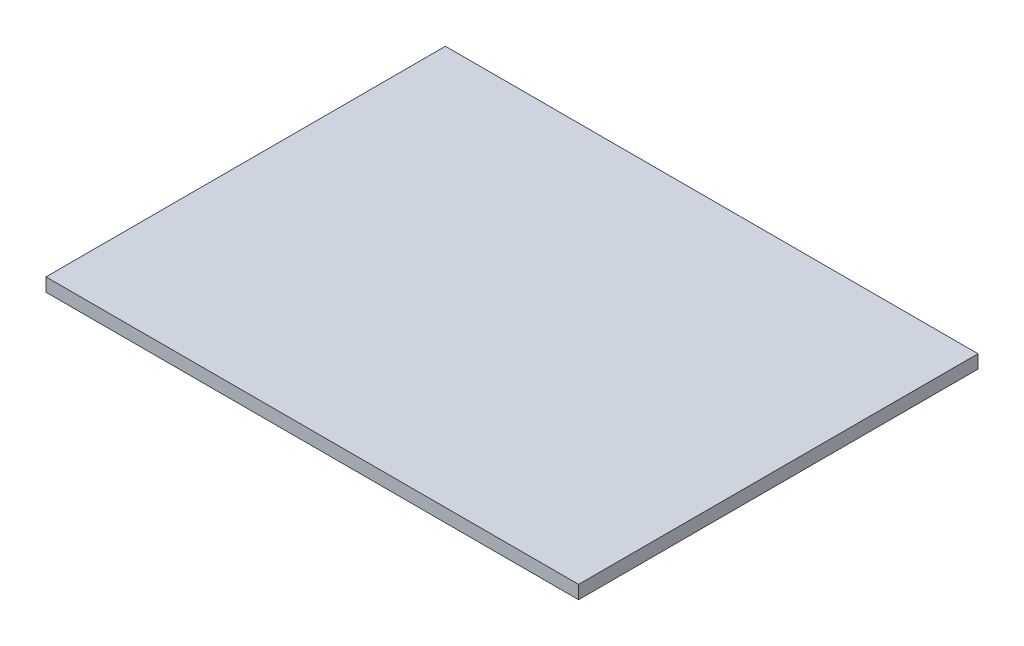
ISO-10303-21;
HEADER;
FILE_DESCRIPTION(('STEP AP214'),'2;1');
FILE_NAME('part.step','',(''),(''),'','','');
FILE_SCHEMA(('AUTOMOTIVE_DESIGN { 1 0 10303 214 1 1 1 1 }'));
ENDSEC;
DATA;
#1=APPLICATION_CONTEXT('core data for automotive mechanical design processes');
#2=APPLICATION_PROTOCOL_DEFINITION('international standard','automotive_design',2000,#1);
#3=PRODUCT_CONTEXT('',#1,'mechanical');
#4=PRODUCT('Part','Part','',(#3));
#5=PRODUCT_RELATED_PRODUCT_CATEGORY('part','',(#4));
#6=PRODUCT_DEFINITION_FORMATION('','',#4);
#7=PRODUCT_DEFINITION_CONTEXT('part definition',#1,'design');
#8=PRODUCT_DEFINITION('design','',#6,#7);
#9=PRODUCT_DEFINITION_SHAPE('','',#8);
#10=(LENGTH_UNIT() NAMED_UNIT(*) SI_UNIT(.MILLI.,.METRE.));
#11=(NAMED_UNIT(*) PLANE_ANGLE_UNIT() SI_UNIT($,.RADIAN.));
#12=(NAMED_UNIT(*) SI_UNIT($,.STERADIAN.) SOLID_ANGLE_UNIT());
#13=UNCERTAINTY_MEASURE_WITH_UNIT(LENGTH_MEASURE(1.E-05),#10,'distance_accuracy_value','');
#14=(GEOMETRIC_REPRESENTATION_CONTEXT(3) GLOBAL_UNCERTAINTY_ASSIGNED_CONTEXT((#13)) GLOBAL_UNIT_ASSIGNED_CONTEXT((#10,
#11,#12)) REPRESENTATION_CONTEXT('',''));
#15=CARTESIAN_POINT('',(0.,0.,0.));
#16=DIRECTION('',(0.,0.,1.));
#17=DIRECTION('',(1.,0.,0.));
#18=AXIS2_PLACEMENT_3D('',#15,#16,#17);
#19=CARTESIAN_POINT('',(-15.,-10.,-25.9807621135332));
#20=DIRECTION('',(-0.866025403784439,0.,-0.5));
#21=DIRECTION('',(-0.5,0.,0.866025403784439));
#22=AXIS2_PLACEMENT_3D('',#19,#20,#21);
#23=PLANE('',#22);
#24=CARTESIAN_POINT('',(-19.0000000000002,-5.,-19.0525588832575));
#25=DIRECTION('',(-0.866025403784443,0.,-0.499999999999992));
#26=DIRECTION('',(-0.499999999999992,0.,0.866025403784443));
#27=AXIS2_PLACEMENT_3D('',#24,#25,#26);
#28=CIRCLE('',#27,1.24999999999999);
#29=CARTESIAN_POINT('',(-19.6250000000002,-5.,-17.9700271285269));
#30=VERTEX_POINT('',#29);
#31=EDGE_CURVE('E247',#30,#30,#28,.T.);
#32=ORIENTED_EDGE('',*,*,#31,.F.);
#33=EDGE_LOOP('',(#32));
#34=FACE_BOUND('',#33,.T.);
#35=CARTESIAN_POINT('',(-26.0000000000001,-5.,-6.92820323027527));
#36=DIRECTION('',(-0.866025403784443,0.,-0.499999999999992));
#37=DIRECTION('',(-0.499999999999992,0.,0.866025403784443));
#38=AXIS2_PLACEMENT_3D('',#35,#36,#37);
#39=CIRCLE('',#38,1.24999999999999);
#40=CARTESIAN_POINT('',(-26.6250000000001,-5.,-5.84567147554473));
#41=VERTEX_POINT('',#40);
#42=EDGE_CURVE('E249',#41,#41,#39,.T.);
#43=ORIENTED_EDGE('',*,*,#42,.F.);
#44=EDGE_LOOP('',(#43));
#45=FACE_BOUND('',#44,.T.);
#46=DIRECTION('',(-0.5,0.,0.866025403784439));
#47=VECTOR('',#46,1.);
#48=CARTESIAN_POINT('',(-15.,0.,-25.9807621135332));
#49=LINE('',#48,#47);
#50=CARTESIAN_POINT('',(-15.,0.,-25.9807621135332));
#51=VERTEX_POINT('',#50);
#52=CARTESIAN_POINT('',(-30.,0.,0.));
#53=VERTEX_POINT('',#52);
#54=EDGE_CURVE('E143',#51,#53,#49,.T.);
#55=ORIENTED_EDGE('',*,*,#54,.F.);
#56=DIRECTION('',(0.,1.,0.));
#57=VECTOR('',#56,1.);
#58=CARTESIAN_POINT('',(-15.,-10.,-25.9807621135332));
#59=LINE('',#58,#57);
#60=CARTESIAN_POINT('',(-15.,-10.,-25.9807621135332));
#61=VERTEX_POINT('',#60);
#62=EDGE_CURVE('E12',#61,#51,#59,.T.);
#63=ORIENTED_EDGE('',*,*,#62,.F.);
#64=DIRECTION('',(-0.5,0.,0.866025403784439));
#65=VECTOR('',#64,1.);
#66=CARTESIAN_POINT('',(-15.,-10.,-25.9807621135332));
#67=LINE('',#66,#65);
#68=CARTESIAN_POINT('',(-30.,-10.,0.));
#69=VERTEX_POINT('',#68);
#70=EDGE_CURVE('E158',#61,#69,#67,.T.);
#71=ORIENTED_EDGE('',*,*,#70,.T.);
#72=DIRECTION('',(0.,1.,0.));
#73=VECTOR('',#72,1.);
#74=CARTESIAN_POINT('',(-30.,-10.,0.));
#75=LINE('',#74,#73);
#76=EDGE_CURVE('E58',#69,#53,#75,.T.);
#77=ORIENTED_EDGE('',*,*,#76,.T.);
#78=EDGE_LOOP('',(#55,#63,#71,#77));
#79=FACE_BOUND('',#78,.T.);
#80=ADVANCED_FACE('F55',(#34,#45,#79),#23,.T.);
#81=CARTESIAN_POINT('',(15.,-10.,-25.9807621135332));
#82=DIRECTION('',(0.,0.,-1.));
#83=DIRECTION('',(-1.,0.,0.));
#84=AXIS2_PLACEMENT_3D('',#81,#82,#83);
#85=PLANE('',#84);
#86=DIRECTION('',(-1.,0.,0.));
#87=VECTOR('',#86,1.);
#88=CARTESIAN_POINT('',(15.,0.,-25.9807621135332));
#89=LINE('',#88,#87);
#90=CARTESIAN_POINT('',(15.,0.,-25.9807621135332));
#91=VERTEX_POINT('',#90);
#92=EDGE_CURVE('E156',#91,#51,#89,.T.);
#93=ORIENTED_EDGE('',*,*,#92,.F.);
#94=DIRECTION('',(0.,1.,0.));
#95=VECTOR('',#94,1.);
#96=CARTESIAN_POINT('',(15.,-10.,-25.9807621135332));
#97=LINE('',#96,#95);
#98=CARTESIAN_POINT('',(15.,-10.,-25.9807621135332));
#99=VERTEX_POINT('',#98);
#100=EDGE_CURVE('E64',#99,#91,#97,.T.);
#101=ORIENTED_EDGE('',*,*,#100,.F.);
#102=DIRECTION('',(-1.,0.,0.));
#103=VECTOR('',#102,1.);
#104=CARTESIAN_POINT('',(15.,-10.,-25.9807621135332));
#105=LINE('',#104,#103);
#106=EDGE_CURVE('E133',#99,#61,#105,.T.);
#107=ORIENTED_EDGE('',*,*,#106,.T.);
#108=ORIENTED_EDGE('',*,*,#62,.T.);
#109=EDGE_LOOP('',(#93,#101,#107,#108));
#110=FACE_BOUND('',#109,.T.);
#111=ADVANCED_FACE('F166',(#110),#85,.T.);
#112=CARTESIAN_POINT('',(30.,-10.,0.));
#113=DIRECTION('',(0.866025403784439,0.,-0.5));
#114=DIRECTION('',(-0.5,0.,-0.866025403784439));
#115=AXIS2_PLACEMENT_3D('',#112,#113,#114);
#116=PLANE('',#115);
#117=CARTESIAN_POINT('',(26.,-5.,-6.92820323027564));
#118=DIRECTION('',(0.866025403784436,0.,-0.500000000000004));
#119=DIRECTION('',(-0.500000000000004,0.,-0.866025403784436));
#120=AXIS2_PLACEMENT_3D('',#117,#118,#119);
#121=CIRCLE('',#120,1.24999999999999);
#122=CARTESIAN_POINT('',(25.375,-5.,-8.01073498500617));
#123=VERTEX_POINT('',#122);
#124=EDGE_CURVE('E257',#123,#123,#121,.T.);
#125=ORIENTED_EDGE('',*,*,#124,.F.);
#126=EDGE_LOOP('',(#125));
#127=FACE_BOUND('',#126,.T.);
#128=CARTESIAN_POINT('',(18.9999999999999,-5.,-19.0525588832577));
#129=DIRECTION('',(0.866025403784436,0.,-0.500000000000004));
#130=DIRECTION('',(-0.500000000000004,0.,-0.866025403784436));
#131=AXIS2_PLACEMENT_3D('',#128,#129,#130);
#132=CIRCLE('',#131,1.24999999999999);
#133=CARTESIAN_POINT('',(18.3749999999999,-5.,-20.1350906379883));
#134=VERTEX_POINT('',#133);
#135=EDGE_CURVE('E263',#134,#134,#132,.T.);
#136=ORIENTED_EDGE('',*,*,#135,.F.);
#137=EDGE_LOOP('',(#136));
#138=FACE_BOUND('',#137,.T.);
#139=DIRECTION('',(-0.5,0.,-0.866025403784439));
#140=VECTOR('',#139,1.);
#141=CARTESIAN_POINT('',(30.,0.,0.));
#142=LINE('',#141,#140);
#143=CARTESIAN_POINT('',(30.,0.,0.));
#144=VERTEX_POINT('',#143);
#145=EDGE_CURVE('E120',#144,#91,#142,.T.);
#146=ORIENTED_EDGE('',*,*,#145,.F.);
#147=DIRECTION('',(0.,1.,0.));
#148=VECTOR('',#147,1.);
#149=CARTESIAN_POINT('',(30.,-10.,0.));
#150=LINE('',#149,#148);
#151=CARTESIAN_POINT('',(30.,-10.,0.));
#152=VERTEX_POINT('',#151);
#153=EDGE_CURVE('E115',#152,#144,#150,.T.);
#154=ORIENTED_EDGE('',*,*,#153,.F.);
#155=DIRECTION('',(-0.5,0.,-0.866025403784439));
#156=VECTOR('',#155,1.);
#157=CARTESIAN_POINT('',(30.,-10.,0.));
#158=LINE('',#157,#156);
#159=EDGE_CURVE('E118',#152,#99,#158,.T.);
#160=ORIENTED_EDGE('',*,*,#159,.T.);
#161=ORIENTED_EDGE('',*,*,#100,.T.);
#162=EDGE_LOOP('',(#146,#154,#160,#161));
#163=FACE_BOUND('',#162,.T.);
#164=ADVANCED_FACE('F117',(#127,#138,#163),#116,.T.);
#165=CARTESIAN_POINT('',(15.,-10.,25.9807621135332));
#166=DIRECTION('',(0.866025403784439,0.,0.5));
#167=DIRECTION('',(0.5,0.,-0.866025403784439));
#168=AXIS2_PLACEMENT_3D('',#165,#166,#167);
#169=PLANE('',#168);
#170=DIRECTION('',(0.5,0.,-0.866025403784439));
#171=VECTOR('',#170,1.);
#172=CARTESIAN_POINT('',(15.,0.,25.9807621135332));
#173=LINE('',#172,#171);
#174=CARTESIAN_POINT('',(15.,0.,25.9807621135332));
#175=VERTEX_POINT('',#174);
#176=EDGE_CURVE('E153',#175,#144,#173,.T.);
#177=ORIENTED_EDGE('',*,*,#176,.F.);
#178=DIRECTION('',(0.,1.,0.));
#179=VECTOR('',#178,1.);
#180=CARTESIAN_POINT('',(15.,-10.,25.9807621135332));
#181=LINE('',#180,#179);
#182=CARTESIAN_POINT('',(15.,-10.,25.9807621135332));
#183=VERTEX_POINT('',#182);
#184=EDGE_CURVE('E125',#183,#175,#181,.T.);
#185=ORIENTED_EDGE('',*,*,#184,.F.);
#186=DIRECTION('',(0.5,0.,-0.866025403784439));
#187=VECTOR('',#186,1.);
#188=CARTESIAN_POINT('',(15.,-10.,25.9807621135332));
#189=LINE('',#188,#187);
#190=EDGE_CURVE('E131',#183,#152,#189,.T.);
#191=ORIENTED_EDGE('',*,*,#190,.T.);
#192=ORIENTED_EDGE('',*,*,#153,.T.);
#193=EDGE_LOOP('',(#177,#185,#191,#192));
#194=FACE_BOUND('',#193,.T.);
#195=ADVANCED_FACE('F135',(#194),#169,.T.);
#196=CARTESIAN_POINT('',(-15.,-10.,25.9807621135332));
#197=DIRECTION('',(0.,0.,1.));
#198=DIRECTION('',(1.,0.,0.));
#199=AXIS2_PLACEMENT_3D('',#196,#197,#198);
#200=PLANE('',#199);
#201=CARTESIAN_POINT('',(-7.,-5.,25.9807621135332));
#202=DIRECTION('',(0.,0.,1.));
#203=DIRECTION('',(1.,0.,0.));
#204=AXIS2_PLACEMENT_3D('',#201,#202,#203);
#205=CIRCLE('',#204,1.24999999999999);
#206=CARTESIAN_POINT('',(-5.75000000000001,-5.,25.9807621135332));
#207=VERTEX_POINT('',#206);
#208=EDGE_CURVE('E269',#207,#207,#205,.T.);
#209=ORIENTED_EDGE('',*,*,#208,.F.);
#210=EDGE_LOOP('',(#209));
#211=FACE_BOUND('',#210,.T.);
#212=CARTESIAN_POINT('',(7.,-5.,25.9807621135332));
#213=DIRECTION('',(0.,0.,1.));
#214=DIRECTION('',(1.,0.,0.));
#215=AXIS2_PLACEMENT_3D('',#212,#213,#214);
#216=CIRCLE('',#215,1.24999999999999);
#217=CARTESIAN_POINT('',(8.24999999999999,-5.,25.9807621135332));
#218=VERTEX_POINT('',#217);
#219=EDGE_CURVE('E275',#218,#218,#216,.T.);
#220=ORIENTED_EDGE('',*,*,#219,.F.);
#221=EDGE_LOOP('',(#220));
#222=FACE_BOUND('',#221,.T.);
#223=DIRECTION('',(1.,0.,0.));
#224=VECTOR('',#223,1.);
#225=CARTESIAN_POINT('',(-15.,0.,25.9807621135332));
#226=LINE('',#225,#224);
#227=CARTESIAN_POINT('',(-15.,0.,25.9807621135332));
#228=VERTEX_POINT('',#227);
#229=EDGE_CURVE('E150',#228,#175,#226,.T.);
#230=ORIENTED_EDGE('',*,*,#229,.F.);
#231=DIRECTION('',(0.,1.,0.));
#232=VECTOR('',#231,1.);
#233=CARTESIAN_POINT('',(-15.,-10.,25.9807621135332));
#234=LINE('',#233,#232);
#235=CARTESIAN_POINT('',(-15.,-10.,25.9807621135332));
#236=VERTEX_POINT('',#235);
#237=EDGE_CURVE('E161',#236,#228,#234,.T.);
#238=ORIENTED_EDGE('',*,*,#237,.F.);
#239=DIRECTION('',(1.,0.,0.));
#240=VECTOR('',#239,1.);
#241=CARTESIAN_POINT('',(-15.,-10.,25.9807621135332));
#242=LINE('',#241,#240);
#243=EDGE_CURVE('E136',#236,#183,#242,.T.);
#244=ORIENTED_EDGE('',*,*,#243,.T.);
#245=ORIENTED_EDGE('',*,*,#184,.T.);
#246=EDGE_LOOP('',(#230,#238,#244,#245));
#247=FACE_BOUND('',#246,.T.);
#248=ADVANCED_FACE('F181',(#211,#222,#247),#200,.T.);
#249=CARTESIAN_POINT('',(-30.,-10.,0.));
#250=DIRECTION('',(-0.866025403784438,0.,0.5));
#251=DIRECTION('',(0.5,0.,0.866025403784439));
#252=AXIS2_PLACEMENT_3D('',#249,#250,#251);
#253=PLANE('',#252);
#254=DIRECTION('',(0.5,0.,0.866025403784439));
#255=VECTOR('',#254,1.);
#256=CARTESIAN_POINT('',(-30.,0.,0.));
#257=LINE('',#256,#255);
#258=EDGE_CURVE('E146',#53,#228,#257,.T.);
#259=ORIENTED_EDGE('',*,*,#258,.F.);
#260=ORIENTED_EDGE('',*,*,#76,.F.);
#261=DIRECTION('',(0.5,0.,0.866025403784439));
#262=VECTOR('',#261,1.);
#263=CARTESIAN_POINT('',(-30.,-10.,0.));
#264=LINE('',#263,#262);
#265=EDGE_CURVE('E138',#69,#236,#264,.T.);
#266=ORIENTED_EDGE('',*,*,#265,.T.);
#267=ORIENTED_EDGE('',*,*,#237,.T.);
#268=EDGE_LOOP('',(#259,#260,#266,#267));
#269=FACE_BOUND('',#268,.T.);
#270=ADVANCED_FACE('F163',(#269),#253,.T.);
#271=CARTESIAN_POINT('',(0.,-10.,0.));
#272=DIRECTION('',(0.,1.,0.));
#273=DIRECTION('',(0.,0.,1.));
#274=AXIS2_PLACEMENT_3D('',#271,#272,#273);
#275=PLANE('',#274);
#276=ORIENTED_EDGE('',*,*,#70,.F.);
#277=ORIENTED_EDGE('',*,*,#106,.F.);
#278=ORIENTED_EDGE('',*,*,#159,.F.);
#279=ORIENTED_EDGE('',*,*,#190,.F.);
#280=ORIENTED_EDGE('',*,*,#243,.F.);
#281=ORIENTED_EDGE('',*,*,#265,.F.);
#282=EDGE_LOOP('',(#276,#277,#278,#279,#280,#281));
#283=FACE_BOUND('',#282,.T.);
#284=ADVANCED_FACE('F129',(#283),#275,.F.);
#285=CARTESIAN_POINT('',(0.,0.,0.));
#286=DIRECTION('',(0.,1.,0.));
#287=DIRECTION('',(0.,0.,1.));
#288=AXIS2_PLACEMENT_3D('',#285,#286,#287);
#289=PLANE('',#288);
#290=ORIENTED_EDGE('',*,*,#54,.T.);
#291=ORIENTED_EDGE('',*,*,#258,.T.);
#292=ORIENTED_EDGE('',*,*,#229,.T.);
#293=ORIENTED_EDGE('',*,*,#176,.T.);
#294=ORIENTED_EDGE('',*,*,#145,.T.);
#295=ORIENTED_EDGE('',*,*,#92,.T.);
#296=EDGE_LOOP('',(#290,#291,#292,#293,#294,#295));
#297=FACE_BOUND('',#296,.T.);
#298=ADVANCED_FACE('F165',(#297),#289,.T.);
#299=CARTESIAN_POINT('',(7.,-5.,15.9807621135332));
#300=DIRECTION('',(0.,0.,1.));
#301=DIRECTION('',(1.,0.,0.));
#302=AXIS2_PLACEMENT_3D('',#299,#300,#301);
#303=CONICAL_SURFACE('',#302,1.25,1.02974425867665);
#304=CARTESIAN_POINT('',(7.,-5.,15.2296863397487));
#305=VERTEX_POINT('',#304);
#306=VERTEX_LOOP('',#305);
#307=FACE_BOUND('',#306,.T.);
#308=CARTESIAN_POINT('',(7.,-5.,15.9807621135332));
#309=DIRECTION('',(0.,0.,1.));
#310=DIRECTION('',(1.,0.,0.));
#311=AXIS2_PLACEMENT_3D('',#308,#309,#310);
#312=CIRCLE('',#311,1.25);
#313=CARTESIAN_POINT('',(8.25,-5.,15.9807621135332));
#314=VERTEX_POINT('',#313);
#315=EDGE_CURVE('E147',#314,#314,#312,.T.);
#316=ORIENTED_EDGE('',*,*,#315,.T.);
#317=EDGE_LOOP('',(#316));
#318=FACE_BOUND('',#317,.T.);
#319=ADVANCED_FACE('F191',(#307,#318),#303,.F.);
#320=CARTESIAN_POINT('',(7.,-5.,25.9807621135332));
#321=DIRECTION('',(0.,0.,1.));
#322=DIRECTION('',(1.,0.,0.));
#323=AXIS2_PLACEMENT_3D('',#320,#321,#322);
#324=CYLINDRICAL_SURFACE('',#323,1.24999999999999);
#325=ORIENTED_EDGE('',*,*,#315,.F.);
#326=EDGE_LOOP('',(#325));
#327=FACE_BOUND('',#326,.T.);
#328=ORIENTED_EDGE('',*,*,#219,.T.);
#329=EDGE_LOOP('',(#328));
#330=FACE_BOUND('',#329,.T.);
#331=ADVANCED_FACE('F195',(#327,#330),#324,.F.);
#332=CARTESIAN_POINT('',(-7.,-5.,15.9807621135332));
#333=DIRECTION('',(0.,0.,1.));
#334=DIRECTION('',(1.,0.,0.));
#335=AXIS2_PLACEMENT_3D('',#332,#333,#334);
#336=CONICAL_SURFACE('',#335,1.25,1.02974425867665);
#337=CARTESIAN_POINT('',(-7.,-5.,15.2296863397487));
#338=VERTEX_POINT('',#337);
#339=VERTEX_LOOP('',#338);
#340=FACE_BOUND('',#339,.T.);
#341=CARTESIAN_POINT('',(-7.,-5.,15.9807621135332));
#342=DIRECTION('',(0.,0.,1.));
#343=DIRECTION('',(1.,0.,0.));
#344=AXIS2_PLACEMENT_3D('',#341,#342,#343);
#345=CIRCLE('',#344,1.25);
#346=CARTESIAN_POINT('',(-5.75,-5.,15.9807621135332));
#347=VERTEX_POINT('',#346);
#348=EDGE_CURVE('E272',#347,#347,#345,.T.);
#349=ORIENTED_EDGE('',*,*,#348,.T.);
#350=EDGE_LOOP('',(#349));
#351=FACE_BOUND('',#350,.T.);
#352=ADVANCED_FACE('F199',(#340,#351),#336,.F.);
#353=CARTESIAN_POINT('',(-7.,-5.,25.9807621135332));
#354=DIRECTION('',(0.,0.,1.));
#355=DIRECTION('',(1.,0.,0.));
#356=AXIS2_PLACEMENT_3D('',#353,#354,#355);
#357=CYLINDRICAL_SURFACE('',#356,1.24999999999999);
#358=ORIENTED_EDGE('',*,*,#348,.F.);
#359=EDGE_LOOP('',(#358));
#360=FACE_BOUND('',#359,.T.);
#361=ORIENTED_EDGE('',*,*,#208,.T.);
#362=EDGE_LOOP('',(#361));
#363=FACE_BOUND('',#362,.T.);
#364=ADVANCED_FACE('F203',(#360,#363),#357,.F.);
#365=CARTESIAN_POINT('',(10.3397459621556,-5.,-14.0525588832577));
#366=DIRECTION('',(0.866025403784436,0.,-0.500000000000004));
#367=DIRECTION('',(-0.500000000000004,0.,-0.866025403784436));
#368=AXIS2_PLACEMENT_3D('',#365,#366,#367);
#369=CONICAL_SURFACE('',#368,1.25,1.02974425867665);
#370=CARTESIAN_POINT('',(9.68929526189117,-5.,-13.6770209963655));
#371=VERTEX_POINT('',#370);
#372=VERTEX_LOOP('',#371);
#373=FACE_BOUND('',#372,.T.);
#374=CARTESIAN_POINT('',(10.3397459621556,-5.,-14.0525588832577));
#375=DIRECTION('',(0.866025403784436,0.,-0.500000000000004));
#376=DIRECTION('',(-0.500000000000004,0.,-0.866025403784436));
#377=AXIS2_PLACEMENT_3D('',#374,#375,#376);
#378=CIRCLE('',#377,1.25);
#379=CARTESIAN_POINT('',(9.71474596215556,-5.,-15.1350906379882));
#380=VERTEX_POINT('',#379);
#381=EDGE_CURVE('E266',#380,#380,#378,.T.);
#382=ORIENTED_EDGE('',*,*,#381,.T.);
#383=EDGE_LOOP('',(#382));
#384=FACE_BOUND('',#383,.T.);
#385=ADVANCED_FACE('F207',(#373,#384),#369,.F.);
#386=CARTESIAN_POINT('',(18.9999999999999,-5.,-19.0525588832577));
#387=DIRECTION('',(0.866025403784436,0.,-0.500000000000004));
#388=DIRECTION('',(-0.500000000000004,0.,-0.866025403784436));
#389=AXIS2_PLACEMENT_3D('',#386,#387,#388);
#390=CYLINDRICAL_SURFACE('',#389,1.24999999999999);
#391=ORIENTED_EDGE('',*,*,#381,.F.);
#392=EDGE_LOOP('',(#391));
#393=FACE_BOUND('',#392,.T.);
#394=ORIENTED_EDGE('',*,*,#135,.T.);
#395=EDGE_LOOP('',(#394));
#396=FACE_BOUND('',#395,.T.);
#397=ADVANCED_FACE('F211',(#393,#396),#390,.F.);
#398=CARTESIAN_POINT('',(17.3397459621556,-5.,-1.9282032302756));
#399=DIRECTION('',(0.866025403784436,0.,-0.500000000000004));
#400=DIRECTION('',(-0.500000000000004,0.,-0.866025403784436));
#401=AXIS2_PLACEMENT_3D('',#398,#399,#400);
#402=CONICAL_SURFACE('',#401,1.25,1.02974425867665);
#403=CARTESIAN_POINT('',(16.6892952618912,-5.,-1.55266534338337));
#404=VERTEX_POINT('',#403);
#405=VERTEX_LOOP('',#404);
#406=FACE_BOUND('',#405,.T.);
#407=CARTESIAN_POINT('',(17.3397459621556,-5.,-1.9282032302756));
#408=DIRECTION('',(0.866025403784436,0.,-0.500000000000004));
#409=DIRECTION('',(-0.500000000000004,0.,-0.866025403784436));
#410=AXIS2_PLACEMENT_3D('',#407,#408,#409);
#411=CIRCLE('',#410,1.25);
#412=CARTESIAN_POINT('',(16.7147459621556,-5.,-3.01073498500614));
#413=VERTEX_POINT('',#412);
#414=EDGE_CURVE('E260',#413,#413,#411,.T.);
#415=ORIENTED_EDGE('',*,*,#414,.T.);
#416=EDGE_LOOP('',(#415));
#417=FACE_BOUND('',#416,.T.);
#418=ADVANCED_FACE('F215',(#406,#417),#402,.F.);
#419=CARTESIAN_POINT('',(26.,-5.,-6.92820323027564));
#420=DIRECTION('',(0.866025403784436,0.,-0.500000000000004));
#421=DIRECTION('',(-0.500000000000004,0.,-0.866025403784436));
#422=AXIS2_PLACEMENT_3D('',#419,#420,#421);
#423=CYLINDRICAL_SURFACE('',#422,1.24999999999999);
#424=ORIENTED_EDGE('',*,*,#414,.F.);
#425=EDGE_LOOP('',(#424));
#426=FACE_BOUND('',#425,.T.);
#427=ORIENTED_EDGE('',*,*,#124,.T.);
#428=EDGE_LOOP('',(#427));
#429=FACE_BOUND('',#428,.T.);
#430=ADVANCED_FACE('F219',(#426,#429),#423,.F.);
#431=CARTESIAN_POINT('',(-17.3397459621556,-5.,-1.92820323027535));
#432=DIRECTION('',(-0.866025403784443,0.,-0.499999999999992));
#433=DIRECTION('',(-0.499999999999992,0.,0.866025403784443));
#434=AXIS2_PLACEMENT_3D('',#431,#432,#433);
#435=CONICAL_SURFACE('',#434,1.25,1.02974425867665);
#436=CARTESIAN_POINT('',(-16.6892952618912,-5.,-1.55266534338313));
#437=VERTEX_POINT('',#436);
#438=VERTEX_LOOP('',#437);
#439=FACE_BOUND('',#438,.T.);
#440=CARTESIAN_POINT('',(-17.3397459621556,-5.,-1.92820323027535));
#441=DIRECTION('',(-0.866025403784443,0.,-0.499999999999992));
#442=DIRECTION('',(-0.499999999999992,0.,0.866025403784443));
#443=AXIS2_PLACEMENT_3D('',#440,#441,#442);
#444=CIRCLE('',#443,1.25);
#445=CARTESIAN_POINT('',(-17.9647459621556,-5.,-0.845671475544797));
#446=VERTEX_POINT('',#445);
#447=EDGE_CURVE('E254',#446,#446,#444,.T.);
#448=ORIENTED_EDGE('',*,*,#447,.T.);
#449=EDGE_LOOP('',(#448));
#450=FACE_BOUND('',#449,.T.);
#451=ADVANCED_FACE('F223',(#439,#450),#435,.F.);
#452=CARTESIAN_POINT('',(-26.0000000000001,-5.,-6.92820323027527));
#453=DIRECTION('',(-0.866025403784443,0.,-0.499999999999992));
#454=DIRECTION('',(-0.499999999999992,0.,0.866025403784443));
#455=AXIS2_PLACEMENT_3D('',#452,#453,#454);
#456=CYLINDRICAL_SURFACE('',#455,1.24999999999999);
#457=ORIENTED_EDGE('',*,*,#447,.F.);
#458=EDGE_LOOP('',(#457));
#459=FACE_BOUND('',#458,.T.);
#460=ORIENTED_EDGE('',*,*,#42,.T.);
#461=EDGE_LOOP('',(#460));
#462=FACE_BOUND('',#461,.T.);
#463=ADVANCED_FACE('F227',(#459,#462),#456,.F.);
#464=CARTESIAN_POINT('',(-10.3397459621557,-5.,-14.0525588832576));
#465=DIRECTION('',(-0.866025403784443,0.,-0.499999999999992));
#466=DIRECTION('',(-0.499999999999992,0.,0.866025403784443));
#467=AXIS2_PLACEMENT_3D('',#464,#465,#466);
#468=CONICAL_SURFACE('',#467,1.25,1.02974425867665);
#469=CARTESIAN_POINT('',(-9.68929526189136,-5.,-13.6770209963653));
#470=VERTEX_POINT('',#469);
#471=VERTEX_LOOP('',#470);
#472=FACE_BOUND('',#471,.T.);
#473=CARTESIAN_POINT('',(-10.3397459621557,-5.,-14.0525588832576));
#474=DIRECTION('',(-0.866025403784443,0.,-0.499999999999992));
#475=DIRECTION('',(-0.499999999999992,0.,0.866025403784443));
#476=AXIS2_PLACEMENT_3D('',#473,#474,#475);
#477=CIRCLE('',#476,1.25);
#478=CARTESIAN_POINT('',(-10.9647459621557,-5.,-12.970027128527));
#479=VERTEX_POINT('',#478);
#480=EDGE_CURVE('E244',#479,#479,#477,.T.);
#481=ORIENTED_EDGE('',*,*,#480,.T.);
#482=EDGE_LOOP('',(#481));
#483=FACE_BOUND('',#482,.T.);
#484=ADVANCED_FACE('F231',(#472,#483),#468,.F.);
#485=CARTESIAN_POINT('',(-19.0000000000002,-5.,-19.0525588832575));
#486=DIRECTION('',(-0.866025403784443,0.,-0.499999999999992));
#487=DIRECTION('',(-0.499999999999992,0.,0.866025403784443));
#488=AXIS2_PLACEMENT_3D('',#485,#486,#487);
#489=CYLINDRICAL_SURFACE('',#488,1.24999999999999);
#490=ORIENTED_EDGE('',*,*,#480,.F.);
#491=EDGE_LOOP('',(#490));
#492=FACE_BOUND('',#491,.T.);
#493=ORIENTED_EDGE('',*,*,#31,.T.);
#494=EDGE_LOOP('',(#493));
#495=FACE_BOUND('',#494,.T.);
#496=ADVANCED_FACE('F235',(#492,#495),#489,.F.);
#497=CLOSED_SHELL('',(#80,#111,#164,#195,#248,#270,#284,#298,#319,#331,#352,#364,#385,#397,#418,
#430,#451,#463,#484,#496));
#498=MANIFOLD_SOLID_BREP('B2',#497);
#499=CARTESIAN_POINT('',(100.,5.,75.));
#500=DIRECTION('',(-1.,0.,0.));
#501=DIRECTION('',(0.,0.,1.));
#502=AXIS2_PLACEMENT_3D('',#499,#500,#501);
#503=PLANE('',#502);
#504=DIRECTION('',(0.,0.,-1.));
#505=VECTOR('',#504,1.);
#506=CARTESIAN_POINT('',(100.,0.,75.));
#507=LINE('',#506,#505);
#508=CARTESIAN_POINT('',(100.,0.,75.));
#509=VERTEX_POINT('',#508);
#510=CARTESIAN_POINT('',(100.,0.,-75.));
#511=VERTEX_POINT('',#510);
#512=EDGE_CURVE('E594',#509,#511,#507,.T.);
#513=ORIENTED_EDGE('',*,*,#512,.T.);
#514=DIRECTION('',(0.,-1.,0.));
#515=VECTOR('',#514,1.);
#516=CARTESIAN_POINT('',(100.,5.,-75.));
#517=LINE('',#516,#515);
#518=CARTESIAN_POINT('',(100.,5.,-75.));
#519=VERTEX_POINT('',#518);
#520=EDGE_CURVE('E53',#519,#511,#517,.T.);
#521=ORIENTED_EDGE('',*,*,#520,.F.);
#522=DIRECTION('',(0.,0.,-1.));
#523=VECTOR('',#522,1.);
#524=CARTESIAN_POINT('',(100.,5.,75.));
#525=LINE('',#524,#523);
#526=CARTESIAN_POINT('',(100.,5.,75.));
#527=VERTEX_POINT('',#526);
#528=EDGE_CURVE('E582',#527,#519,#525,.T.);
#529=ORIENTED_EDGE('',*,*,#528,.F.);
#530=DIRECTION('',(0.,-1.,0.));
#531=VECTOR('',#530,1.);
#532=CARTESIAN_POINT('',(100.,5.,75.));
#533=LINE('',#532,#531);
#534=EDGE_CURVE('E590',#527,#509,#533,.T.);
#535=ORIENTED_EDGE('',*,*,#534,.T.);
#536=EDGE_LOOP('',(#513,#521,#529,#535));
#537=FACE_BOUND('',#536,.T.);
#538=ADVANCED_FACE('F531',(#537),#503,.F.);
#539=CARTESIAN_POINT('',(-100.,5.,-75.));
#540=DIRECTION('',(0.,0.,1.));
#541=DIRECTION('',(1.,0.,0.));
#542=AXIS2_PLACEMENT_3D('',#539,#540,#541);
#543=PLANE('',#542);
#544=DIRECTION('',(-1.,0.,0.));
#545=VECTOR('',#544,1.);
#546=CARTESIAN_POINT('',(-100.,0.,-75.));
#547=LINE('',#546,#545);
#548=CARTESIAN_POINT('',(-100.,0.,-75.));
#549=VERTEX_POINT('',#548);
#550=EDGE_CURVE('E586',#511,#549,#547,.T.);
#551=ORIENTED_EDGE('',*,*,#550,.T.);
#552=DIRECTION('',(0.,-1.,0.));
#553=VECTOR('',#552,1.);
#554=CARTESIAN_POINT('',(-100.,5.,-75.));
#555=LINE('',#554,#553);
#556=CARTESIAN_POINT('',(-100.,5.,-75.));
#557=VERTEX_POINT('',#556);
#558=EDGE_CURVE('E539',#557,#549,#555,.T.);
#559=ORIENTED_EDGE('',*,*,#558,.F.);
#560=DIRECTION('',(-1.,0.,0.));
#561=VECTOR('',#560,1.);
#562=CARTESIAN_POINT('',(-100.,5.,-75.));
#563=LINE('',#562,#561);
#564=EDGE_CURVE('E577',#519,#557,#563,.T.);
#565=ORIENTED_EDGE('',*,*,#564,.F.);
#566=ORIENTED_EDGE('',*,*,#520,.T.);
#567=EDGE_LOOP('',(#551,#559,#565,#566));
#568=FACE_BOUND('',#567,.T.);
#569=ADVANCED_FACE('F585',(#568),#543,.F.);
#570=CARTESIAN_POINT('',(-100.,5.,75.));
#571=DIRECTION('',(1.,0.,0.));
#572=DIRECTION('',(0.,0.,-1.));
#573=AXIS2_PLACEMENT_3D('',#570,#571,#572);
#574=PLANE('',#573);
#575=DIRECTION('',(0.,0.,1.));
#576=VECTOR('',#575,1.);
#577=CARTESIAN_POINT('',(-100.,0.,75.));
#578=LINE('',#577,#576);
#579=CARTESIAN_POINT('',(-100.,0.,75.));
#580=VERTEX_POINT('',#579);
#581=EDGE_CURVE('E564',#549,#580,#578,.T.);
#582=ORIENTED_EDGE('',*,*,#581,.T.);
#583=DIRECTION('',(0.,-1.,0.));
#584=VECTOR('',#583,1.);
#585=CARTESIAN_POINT('',(-100.,5.,75.));
#586=LINE('',#585,#584);
#587=CARTESIAN_POINT('',(-100.,5.,75.));
#588=VERTEX_POINT('',#587);
#589=EDGE_CURVE('E587',#588,#580,#586,.T.);
#590=ORIENTED_EDGE('',*,*,#589,.F.);
#591=DIRECTION('',(0.,0.,1.));
#592=VECTOR('',#591,1.);
#593=CARTESIAN_POINT('',(-100.,5.,75.));
#594=LINE('',#593,#592);
#595=EDGE_CURVE('E580',#557,#588,#594,.T.);
#596=ORIENTED_EDGE('',*,*,#595,.F.);
#597=ORIENTED_EDGE('',*,*,#558,.T.);
#598=EDGE_LOOP('',(#582,#590,#596,#597));
#599=FACE_BOUND('',#598,.T.);
#600=ADVANCED_FACE('F588',(#599),#574,.F.);
#601=CARTESIAN_POINT('',(-100.,5.,75.));
#602=DIRECTION('',(0.,0.,-1.));
#603=DIRECTION('',(-1.,0.,0.));
#604=AXIS2_PLACEMENT_3D('',#601,#602,#603);
#605=PLANE('',#604);
#606=DIRECTION('',(1.,0.,0.));
#607=VECTOR('',#606,1.);
#608=CARTESIAN_POINT('',(-100.,0.,75.));
#609=LINE('',#608,#607);
#610=EDGE_CURVE('E570',#580,#509,#609,.T.);
#611=ORIENTED_EDGE('',*,*,#610,.T.);
#612=ORIENTED_EDGE('',*,*,#534,.F.);
#613=DIRECTION('',(1.,0.,0.));
#614=VECTOR('',#613,1.);
#615=CARTESIAN_POINT('',(-100.,5.,75.));
#616=LINE('',#615,#614);
#617=EDGE_CURVE('E547',#588,#527,#616,.T.);
#618=ORIENTED_EDGE('',*,*,#617,.F.);
#619=ORIENTED_EDGE('',*,*,#589,.T.);
#620=EDGE_LOOP('',(#611,#612,#618,#619));
#621=FACE_BOUND('',#620,.T.);
#622=ADVANCED_FACE('F601',(#621),#605,.F.);
#623=CARTESIAN_POINT('',(0.,5.,0.));
#624=DIRECTION('',(0.,-1.,0.));
#625=DIRECTION('',(0.,0.,-1.));
#626=AXIS2_PLACEMENT_3D('',#623,#624,#625);
#627=PLANE('',#626);
#628=ORIENTED_EDGE('',*,*,#528,.T.);
#629=ORIENTED_EDGE('',*,*,#564,.T.);
#630=ORIENTED_EDGE('',*,*,#595,.T.);
#631=ORIENTED_EDGE('',*,*,#617,.T.);
#632=EDGE_LOOP('',(#628,#629,#630,#631));
#633=FACE_BOUND('',#632,.T.);
#634=ADVANCED_FACE('F578',(#633),#627,.F.);
#635=CARTESIAN_POINT('',(0.,0.,0.));
#636=DIRECTION('',(0.,-1.,0.));
#637=DIRECTION('',(0.,0.,-1.));
#638=AXIS2_PLACEMENT_3D('',#635,#636,#637);
#639=PLANE('',#638);
#640=ORIENTED_EDGE('',*,*,#512,.F.);
#641=ORIENTED_EDGE('',*,*,#610,.F.);
#642=ORIENTED_EDGE('',*,*,#581,.F.);
#643=ORIENTED_EDGE('',*,*,#550,.F.);
#644=EDGE_LOOP('',(#640,#641,#642,#643));
#645=FACE_BOUND('',#644,.T.);
#646=ADVANCED_FACE('F604',(#645),#639,.T.);
#647=CLOSED_SHELL('',(#538,#569,#600,#622,#634,#646));
#648=MANIFOLD_SOLID_BREP('B6',#647);
#649=ADVANCED_BREP_SHAPE_REPRESENTATION('',(#18,#498,#648),#14);
#650=SHAPE_DEFINITION_REPRESENTATION(#9,#649);
ENDSEC;
END-ISO-10303-21;
